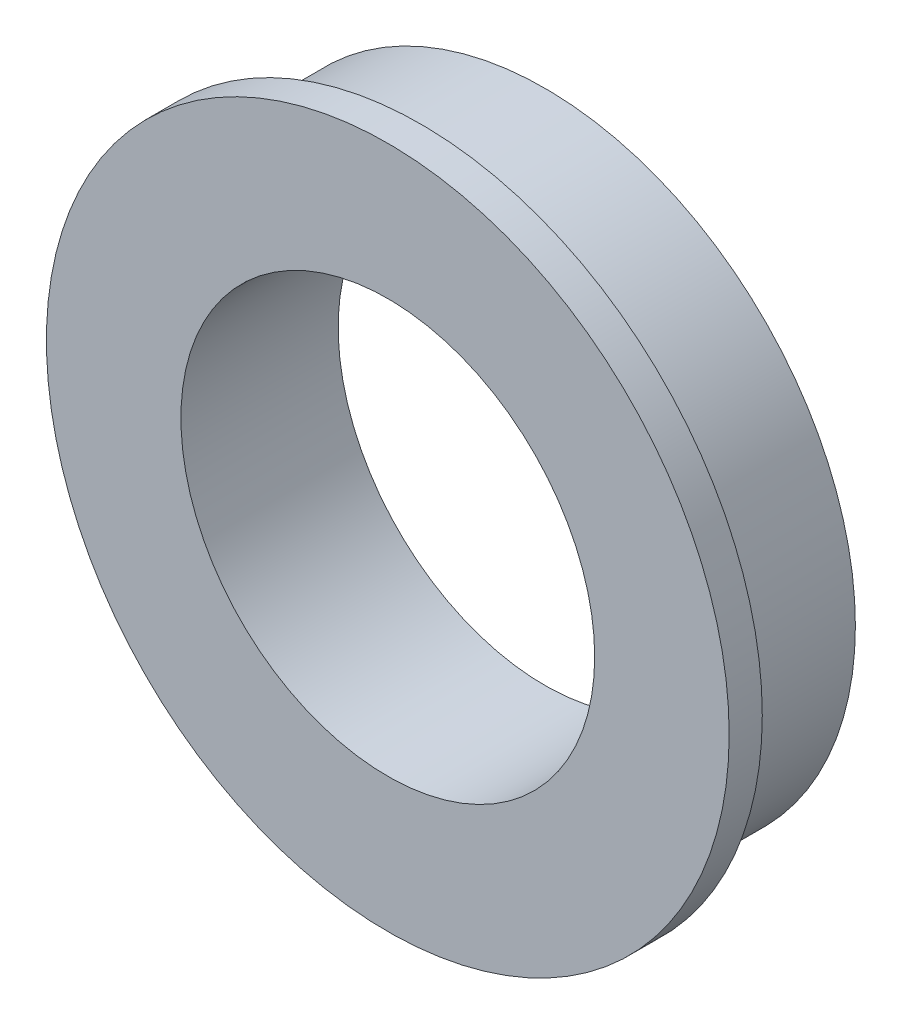
ISO-10303-21;
HEADER;
FILE_DESCRIPTION(('STEP AP214'),'2;1');
FILE_NAME('part.step','',(''),(''),'','','');
FILE_SCHEMA(('AUTOMOTIVE_DESIGN { 1 0 10303 214 1 1 1 1 }'));
ENDSEC;
DATA;
#1=APPLICATION_CONTEXT('core data for automotive mechanical design processes');
#2=APPLICATION_PROTOCOL_DEFINITION('international standard','automotive_design',2000,#1);
#3=PRODUCT_CONTEXT('',#1,'mechanical');
#4=PRODUCT('Part','Part','',(#3));
#5=PRODUCT_RELATED_PRODUCT_CATEGORY('part','',(#4));
#6=PRODUCT_DEFINITION_FORMATION('','',#4);
#7=PRODUCT_DEFINITION_CONTEXT('part definition',#1,'design');
#8=PRODUCT_DEFINITION('design','',#6,#7);
#9=PRODUCT_DEFINITION_SHAPE('','',#8);
#10=(LENGTH_UNIT() NAMED_UNIT(*) SI_UNIT(.MILLI.,.METRE.));
#11=(NAMED_UNIT(*) PLANE_ANGLE_UNIT() SI_UNIT($,.RADIAN.));
#12=(NAMED_UNIT(*) SI_UNIT($,.STERADIAN.) SOLID_ANGLE_UNIT());
#13=UNCERTAINTY_MEASURE_WITH_UNIT(LENGTH_MEASURE(1.E-05),#10,'distance_accuracy_value','');
#14=(GEOMETRIC_REPRESENTATION_CONTEXT(3) GLOBAL_UNCERTAINTY_ASSIGNED_CONTEXT((#13)) GLOBAL_UNIT_ASSIGNED_CONTEXT((#10,
#11,#12)) REPRESENTATION_CONTEXT('',''));
#15=CARTESIAN_POINT('',(0.,0.,0.));
#16=DIRECTION('',(0.,0.,1.));
#17=DIRECTION('',(1.,0.,0.));
#18=AXIS2_PLACEMENT_3D('',#15,#16,#17);
#19=CARTESIAN_POINT('',(0.,0.,0.));
#20=DIRECTION('',(0.,0.,1.));
#21=DIRECTION('',(1.,0.,0.));
#22=AXIS2_PLACEMENT_3D('',#19,#20,#21);
#23=PLANE('',#22);
#24=CARTESIAN_POINT('',(0.,0.,0.));
#25=DIRECTION('',(0.,0.,1.));
#26=DIRECTION('',(1.,0.,0.));
#27=AXIS2_PLACEMENT_3D('',#24,#25,#26);
#28=CIRCLE('',#27,7.5);
#29=CARTESIAN_POINT('',(7.5,0.,0.));
#30=VERTEX_POINT('',#29);
#31=EDGE_CURVE('E37',#30,#30,#28,.T.);
#32=ORIENTED_EDGE('',*,*,#31,.F.);
#33=EDGE_LOOP('',(#32));
#34=FACE_BOUND('',#33,.T.);
#35=CARTESIAN_POINT('',(0.,0.,0.));
#36=DIRECTION('',(0.,0.,1.));
#37=DIRECTION('',(1.,0.,0.));
#38=AXIS2_PLACEMENT_3D('',#35,#36,#37);
#39=CIRCLE('',#38,5.);
#40=CARTESIAN_POINT('',(5.,0.,0.));
#41=VERTEX_POINT('',#40);
#42=EDGE_CURVE('E44',#41,#41,#39,.T.);
#43=ORIENTED_EDGE('',*,*,#42,.T.);
#44=EDGE_LOOP('',(#43));
#45=FACE_BOUND('',#44,.T.);
#46=ADVANCED_FACE('F33',(#34,#45),#23,.F.);
#47=CARTESIAN_POINT('',(0.,0.,3.));
#48=DIRECTION('',(0.,0.,-1.));
#49=DIRECTION('',(-1.,0.,0.));
#50=AXIS2_PLACEMENT_3D('',#47,#48,#49);
#51=CYLINDRICAL_SURFACE('',#50,7.5);
#52=CARTESIAN_POINT('',(0.,0.,3.));
#53=DIRECTION('',(0.,0.,1.));
#54=DIRECTION('',(1.,0.,0.));
#55=AXIS2_PLACEMENT_3D('',#52,#53,#54);
#56=CIRCLE('',#55,7.5);
#57=CARTESIAN_POINT('',(7.5,0.,3.));
#58=VERTEX_POINT('',#57);
#59=EDGE_CURVE('E10',#58,#58,#56,.T.);
#60=ORIENTED_EDGE('',*,*,#59,.F.);
#61=EDGE_LOOP('',(#60));
#62=FACE_BOUND('',#61,.T.);
#63=ORIENTED_EDGE('',*,*,#31,.T.);
#64=EDGE_LOOP('',(#63));
#65=FACE_BOUND('',#64,.T.);
#66=ADVANCED_FACE('F35',(#62,#65),#51,.T.);
#67=CARTESIAN_POINT('',(0.,0.,3.));
#68=DIRECTION('',(0.,0.,-1.));
#69=DIRECTION('',(-1.,0.,0.));
#70=AXIS2_PLACEMENT_3D('',#67,#68,#69);
#71=CYLINDRICAL_SURFACE('',#70,5.);
#72=ORIENTED_EDGE('',*,*,#42,.F.);
#73=EDGE_LOOP('',(#72));
#74=FACE_BOUND('',#73,.T.);
#75=CARTESIAN_POINT('',(0.,0.,3.8));
#76=DIRECTION('',(0.,0.,1.));
#77=DIRECTION('',(1.,0.,0.));
#78=AXIS2_PLACEMENT_3D('',#75,#76,#77);
#79=CIRCLE('',#78,5.);
#80=CARTESIAN_POINT('',(5.,0.,3.8));
#81=VERTEX_POINT('',#80);
#82=EDGE_CURVE('E52',#81,#81,#79,.T.);
#83=ORIENTED_EDGE('',*,*,#82,.T.);
#84=EDGE_LOOP('',(#83));
#85=FACE_BOUND('',#84,.T.);
#86=ADVANCED_FACE('F58',(#74,#85),#71,.F.);
#87=CARTESIAN_POINT('',(0.,0.,3.));
#88=DIRECTION('',(0.,0.,1.));
#89=DIRECTION('',(1.,0.,0.));
#90=AXIS2_PLACEMENT_3D('',#87,#88,#89);
#91=PLANE('',#90);
#92=CARTESIAN_POINT('',(0.,0.,3.));
#93=DIRECTION('',(0.,0.,1.));
#94=DIRECTION('',(1.,0.,0.));
#95=AXIS2_PLACEMENT_3D('',#92,#93,#94);
#96=CIRCLE('',#95,8.25);
#97=CARTESIAN_POINT('',(8.25,0.,3.));
#98=VERTEX_POINT('',#97);
#99=EDGE_CURVE('E49',#98,#98,#96,.T.);
#100=ORIENTED_EDGE('',*,*,#99,.F.);
#101=EDGE_LOOP('',(#100));
#102=FACE_BOUND('',#101,.T.);
#103=ORIENTED_EDGE('',*,*,#59,.T.);
#104=EDGE_LOOP('',(#103));
#105=FACE_BOUND('',#104,.T.);
#106=ADVANCED_FACE('F63',(#102,#105),#91,.F.);
#107=CARTESIAN_POINT('',(0.,0.,3.8));
#108=DIRECTION('',(0.,0.,1.));
#109=DIRECTION('',(1.,0.,0.));
#110=AXIS2_PLACEMENT_3D('',#107,#108,#109);
#111=PLANE('',#110);
#112=CARTESIAN_POINT('',(0.,0.,3.8));
#113=DIRECTION('',(0.,0.,1.));
#114=DIRECTION('',(1.,0.,0.));
#115=AXIS2_PLACEMENT_3D('',#112,#113,#114);
#116=CIRCLE('',#115,8.25);
#117=CARTESIAN_POINT('',(8.25,0.,3.8));
#118=VERTEX_POINT('',#117);
#119=EDGE_CURVE('E48',#118,#118,#116,.T.);
#120=ORIENTED_EDGE('',*,*,#119,.T.);
#121=EDGE_LOOP('',(#120));
#122=FACE_BOUND('',#121,.T.);
#123=ORIENTED_EDGE('',*,*,#82,.F.);
#124=EDGE_LOOP('',(#123));
#125=FACE_BOUND('',#124,.T.);
#126=ADVANCED_FACE('F60',(#122,#125),#111,.T.);
#127=CARTESIAN_POINT('',(0.,0.,3.8));
#128=DIRECTION('',(0.,0.,-1.));
#129=DIRECTION('',(-1.,0.,0.));
#130=AXIS2_PLACEMENT_3D('',#127,#128,#129);
#131=CYLINDRICAL_SURFACE('',#130,8.25);
#132=ORIENTED_EDGE('',*,*,#119,.F.);
#133=EDGE_LOOP('',(#132));
#134=FACE_BOUND('',#133,.T.);
#135=ORIENTED_EDGE('',*,*,#99,.T.);
#136=EDGE_LOOP('',(#135));
#137=FACE_BOUND('',#136,.T.);
#138=ADVANCED_FACE('F62',(#134,#137),#131,.T.);
#139=CLOSED_SHELL('',(#46,#66,#86,#106,#126,#138));
#140=MANIFOLD_SOLID_BREP('B2',#139);
#141=ADVANCED_BREP_SHAPE_REPRESENTATION('',(#18,#140),#14);
#142=SHAPE_DEFINITION_REPRESENTATION(#9,#141);
ENDSEC;
END-ISO-10303-21;
